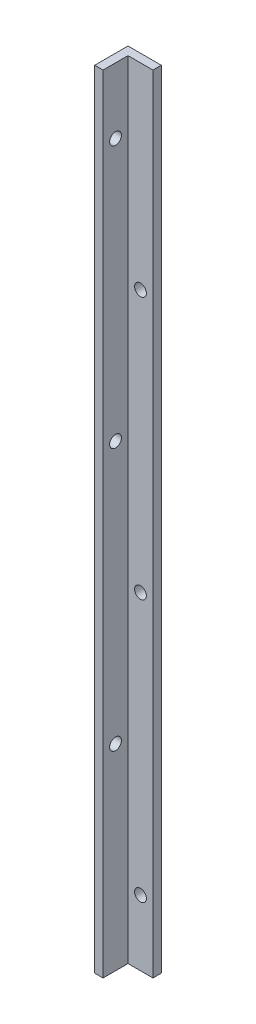
ISO-10303-21;
HEADER;
FILE_DESCRIPTION(('STEP AP214'),'2;1');
FILE_NAME('part.step','',(''),(''),'','','');
FILE_SCHEMA(('AUTOMOTIVE_DESIGN { 1 0 10303 214 1 1 1 1 }'));
ENDSEC;
DATA;
#1=APPLICATION_CONTEXT('core data for automotive mechanical design processes');
#2=APPLICATION_PROTOCOL_DEFINITION('international standard','automotive_design',2000,#1);
#3=PRODUCT_CONTEXT('',#1,'mechanical');
#4=PRODUCT('Part','Part','',(#3));
#5=PRODUCT_RELATED_PRODUCT_CATEGORY('part','',(#4));
#6=PRODUCT_DEFINITION_FORMATION('','',#4);
#7=PRODUCT_DEFINITION_CONTEXT('part definition',#1,'design');
#8=PRODUCT_DEFINITION('design','',#6,#7);
#9=PRODUCT_DEFINITION_SHAPE('','',#8);
#10=(LENGTH_UNIT() NAMED_UNIT(*) SI_UNIT(.MILLI.,.METRE.));
#11=(NAMED_UNIT(*) PLANE_ANGLE_UNIT() SI_UNIT($,.RADIAN.));
#12=(NAMED_UNIT(*) SI_UNIT($,.STERADIAN.) SOLID_ANGLE_UNIT());
#13=UNCERTAINTY_MEASURE_WITH_UNIT(LENGTH_MEASURE(1.E-05),#10,'distance_accuracy_value','');
#14=(GEOMETRIC_REPRESENTATION_CONTEXT(3) GLOBAL_UNCERTAINTY_ASSIGNED_CONTEXT((#13)) GLOBAL_UNIT_ASSIGNED_CONTEXT((#10,
#11,#12)) REPRESENTATION_CONTEXT('',''));
#15=CARTESIAN_POINT('',(0.,0.,0.));
#16=DIRECTION('',(0.,0.,1.));
#17=DIRECTION('',(1.,0.,0.));
#18=AXIS2_PLACEMENT_3D('',#15,#16,#17);
#19=CARTESIAN_POINT('',(0.,300.,0.));
#20=DIRECTION('',(0.,0.,1.));
#21=DIRECTION('',(1.,0.,0.));
#22=AXIS2_PLACEMENT_3D('',#19,#20,#21);
#23=PLANE('',#22);
#24=CARTESIAN_POINT('',(7.94000000000001,225.,0.));
#25=DIRECTION('',(0.,0.,1.));
#26=DIRECTION('',(1.,0.,0.));
#27=AXIS2_PLACEMENT_3D('',#24,#25,#26);
#28=CIRCLE('',#27,2.25);
#29=CARTESIAN_POINT('',(10.19,225.,0.));
#30=VERTEX_POINT('',#29);
#31=EDGE_CURVE('E169',#30,#30,#28,.T.);
#32=ORIENTED_EDGE('',*,*,#31,.T.);
#33=EDGE_LOOP('',(#32));
#34=FACE_BOUND('',#33,.T.);
#35=CARTESIAN_POINT('',(7.94000000000001,125.,0.));
#36=DIRECTION('',(0.,0.,1.));
#37=DIRECTION('',(1.,0.,0.));
#38=AXIS2_PLACEMENT_3D('',#35,#36,#37);
#39=CIRCLE('',#38,2.25);
#40=CARTESIAN_POINT('',(10.19,125.,0.));
#41=VERTEX_POINT('',#40);
#42=EDGE_CURVE('E173',#41,#41,#39,.T.);
#43=ORIENTED_EDGE('',*,*,#42,.T.);
#44=EDGE_LOOP('',(#43));
#45=FACE_BOUND('',#44,.T.);
#46=CARTESIAN_POINT('',(7.94000000000001,25.,0.));
#47=DIRECTION('',(0.,0.,1.));
#48=DIRECTION('',(1.,0.,0.));
#49=AXIS2_PLACEMENT_3D('',#46,#47,#48);
#50=CIRCLE('',#49,2.25);
#51=CARTESIAN_POINT('',(10.19,25.,0.));
#52=VERTEX_POINT('',#51);
#53=EDGE_CURVE('E176',#52,#52,#50,.T.);
#54=ORIENTED_EDGE('',*,*,#53,.T.);
#55=EDGE_LOOP('',(#54));
#56=FACE_BOUND('',#55,.T.);
#57=DIRECTION('',(-1.,0.,0.));
#58=VECTOR('',#57,1.);
#59=CARTESIAN_POINT('',(0.,0.,0.));
#60=LINE('',#59,#58);
#61=CARTESIAN_POINT('',(12.7,0.,0.));
#62=VERTEX_POINT('',#61);
#63=CARTESIAN_POINT('',(0.,0.,0.));
#64=VERTEX_POINT('',#63);
#65=EDGE_CURVE('E124',#62,#64,#60,.T.);
#66=ORIENTED_EDGE('',*,*,#65,.T.);
#67=DIRECTION('',(0.,-1.,0.));
#68=VECTOR('',#67,1.);
#69=CARTESIAN_POINT('',(0.,300.,0.));
#70=LINE('',#69,#68);
#71=CARTESIAN_POINT('',(0.,300.,0.));
#72=VERTEX_POINT('',#71);
#73=EDGE_CURVE('E11',#72,#64,#70,.T.);
#74=ORIENTED_EDGE('',*,*,#73,.F.);
#75=DIRECTION('',(-1.,0.,0.));
#76=VECTOR('',#75,1.);
#77=CARTESIAN_POINT('',(0.,300.,0.));
#78=LINE('',#77,#76);
#79=CARTESIAN_POINT('',(12.7,300.,0.));
#80=VERTEX_POINT('',#79);
#81=EDGE_CURVE('E135',#80,#72,#78,.T.);
#82=ORIENTED_EDGE('',*,*,#81,.F.);
#83=DIRECTION('',(0.,-1.,0.));
#84=VECTOR('',#83,1.);
#85=CARTESIAN_POINT('',(12.7,300.,0.));
#86=LINE('',#85,#84);
#87=EDGE_CURVE('E120',#80,#62,#86,.T.);
#88=ORIENTED_EDGE('',*,*,#87,.T.);
#89=EDGE_LOOP('',(#66,#74,#82,#88));
#90=FACE_BOUND('',#89,.T.);
#91=ADVANCED_FACE('F40',(#34,#45,#56,#90),#23,.F.);
#92=CARTESIAN_POINT('',(0.,300.,0.));
#93=DIRECTION('',(1.,0.,0.));
#94=DIRECTION('',(0.,0.,-1.));
#95=AXIS2_PLACEMENT_3D('',#92,#93,#94);
#96=PLANE('',#95);
#97=CARTESIAN_POINT('',(0.,275.,7.94));
#98=DIRECTION('',(1.,0.,0.));
#99=DIRECTION('',(0.,0.,-1.));
#100=AXIS2_PLACEMENT_3D('',#97,#98,#99);
#101=CIRCLE('',#100,2.25);
#102=CARTESIAN_POINT('',(0.,275.,5.68999999999999));
#103=VERTEX_POINT('',#102);
#104=EDGE_CURVE('E128',#103,#103,#101,.T.);
#105=ORIENTED_EDGE('',*,*,#104,.T.);
#106=EDGE_LOOP('',(#105));
#107=FACE_BOUND('',#106,.T.);
#108=CARTESIAN_POINT('',(0.,175.,7.94));
#109=DIRECTION('',(1.,0.,0.));
#110=DIRECTION('',(0.,0.,-1.));
#111=AXIS2_PLACEMENT_3D('',#108,#109,#110);
#112=CIRCLE('',#111,2.25);
#113=CARTESIAN_POINT('',(0.,175.,5.68999999999999));
#114=VERTEX_POINT('',#113);
#115=EDGE_CURVE('E201',#114,#114,#112,.T.);
#116=ORIENTED_EDGE('',*,*,#115,.T.);
#117=EDGE_LOOP('',(#116));
#118=FACE_BOUND('',#117,.T.);
#119=CARTESIAN_POINT('',(0.,75.,7.94));
#120=DIRECTION('',(1.,0.,0.));
#121=DIRECTION('',(0.,0.,-1.));
#122=AXIS2_PLACEMENT_3D('',#119,#120,#121);
#123=CIRCLE('',#122,2.25);
#124=CARTESIAN_POINT('',(0.,75.,5.68999999999999));
#125=VERTEX_POINT('',#124);
#126=EDGE_CURVE('E193',#125,#125,#123,.T.);
#127=ORIENTED_EDGE('',*,*,#126,.T.);
#128=EDGE_LOOP('',(#127));
#129=FACE_BOUND('',#128,.T.);
#130=DIRECTION('',(0.,0.,1.));
#131=VECTOR('',#130,1.);
#132=CARTESIAN_POINT('',(0.,0.,0.));
#133=LINE('',#132,#131);
#134=CARTESIAN_POINT('',(0.,0.,12.7));
#135=VERTEX_POINT('',#134);
#136=EDGE_CURVE('E127',#64,#135,#133,.T.);
#137=ORIENTED_EDGE('',*,*,#136,.T.);
#138=DIRECTION('',(0.,-1.,0.));
#139=VECTOR('',#138,1.);
#140=CARTESIAN_POINT('',(0.,300.,12.7));
#141=LINE('',#140,#139);
#142=CARTESIAN_POINT('',(0.,300.,12.7));
#143=VERTEX_POINT('',#142);
#144=EDGE_CURVE('E48',#143,#135,#141,.T.);
#145=ORIENTED_EDGE('',*,*,#144,.F.);
#146=DIRECTION('',(0.,0.,1.));
#147=VECTOR('',#146,1.);
#148=CARTESIAN_POINT('',(0.,300.,0.));
#149=LINE('',#148,#147);
#150=EDGE_CURVE('E93',#72,#143,#149,.T.);
#151=ORIENTED_EDGE('',*,*,#150,.F.);
#152=ORIENTED_EDGE('',*,*,#73,.T.);
#153=EDGE_LOOP('',(#137,#145,#151,#152));
#154=FACE_BOUND('',#153,.T.);
#155=ADVANCED_FACE('F160',(#107,#118,#129,#154),#96,.F.);
#156=CARTESIAN_POINT('',(0.,300.,12.7));
#157=DIRECTION('',(0.,0.,-1.));
#158=DIRECTION('',(-1.,0.,0.));
#159=AXIS2_PLACEMENT_3D('',#156,#157,#158);
#160=PLANE('',#159);
#161=DIRECTION('',(1.,0.,0.));
#162=VECTOR('',#161,1.);
#163=CARTESIAN_POINT('',(0.,0.,12.7));
#164=LINE('',#163,#162);
#165=CARTESIAN_POINT('',(3.18,0.,12.7));
#166=VERTEX_POINT('',#165);
#167=EDGE_CURVE('E130',#135,#166,#164,.T.);
#168=ORIENTED_EDGE('',*,*,#167,.T.);
#169=DIRECTION('',(0.,-1.,0.));
#170=VECTOR('',#169,1.);
#171=CARTESIAN_POINT('',(3.18,300.,12.7));
#172=LINE('',#171,#170);
#173=CARTESIAN_POINT('',(3.18,300.,12.7));
#174=VERTEX_POINT('',#173);
#175=EDGE_CURVE('E115',#174,#166,#172,.T.);
#176=ORIENTED_EDGE('',*,*,#175,.F.);
#177=DIRECTION('',(1.,0.,0.));
#178=VECTOR('',#177,1.);
#179=CARTESIAN_POINT('',(0.,300.,12.7));
#180=LINE('',#179,#178);
#181=EDGE_CURVE('E106',#143,#174,#180,.T.);
#182=ORIENTED_EDGE('',*,*,#181,.F.);
#183=ORIENTED_EDGE('',*,*,#144,.T.);
#184=EDGE_LOOP('',(#168,#176,#182,#183));
#185=FACE_BOUND('',#184,.T.);
#186=ADVANCED_FACE('F141',(#185),#160,.F.);
#187=CARTESIAN_POINT('',(3.18,300.,3.18));
#188=DIRECTION('',(-1.,0.,0.));
#189=DIRECTION('',(0.,0.,1.));
#190=AXIS2_PLACEMENT_3D('',#187,#188,#189);
#191=PLANE('',#190);
#192=CARTESIAN_POINT('',(3.18,275.,7.94));
#193=DIRECTION('',(1.,0.,0.));
#194=DIRECTION('',(0.,0.,-1.));
#195=AXIS2_PLACEMENT_3D('',#192,#193,#194);
#196=CIRCLE('',#195,2.25);
#197=CARTESIAN_POINT('',(3.18,275.,5.68999999999999));
#198=VERTEX_POINT('',#197);
#199=EDGE_CURVE('E190',#198,#198,#196,.T.);
#200=ORIENTED_EDGE('',*,*,#199,.F.);
#201=EDGE_LOOP('',(#200));
#202=FACE_BOUND('',#201,.T.);
#203=CARTESIAN_POINT('',(3.18,175.,7.94));
#204=DIRECTION('',(1.,0.,0.));
#205=DIRECTION('',(0.,0.,-1.));
#206=AXIS2_PLACEMENT_3D('',#203,#204,#205);
#207=CIRCLE('',#206,2.25);
#208=CARTESIAN_POINT('',(3.18,175.,5.68999999999999));
#209=VERTEX_POINT('',#208);
#210=EDGE_CURVE('E194',#209,#209,#207,.T.);
#211=ORIENTED_EDGE('',*,*,#210,.F.);
#212=EDGE_LOOP('',(#211));
#213=FACE_BOUND('',#212,.T.);
#214=CARTESIAN_POINT('',(3.18,75.,7.94));
#215=DIRECTION('',(1.,0.,0.));
#216=DIRECTION('',(0.,0.,-1.));
#217=AXIS2_PLACEMENT_3D('',#214,#215,#216);
#218=CIRCLE('',#217,2.25);
#219=CARTESIAN_POINT('',(3.18,75.,5.68999999999999));
#220=VERTEX_POINT('',#219);
#221=EDGE_CURVE('E189',#220,#220,#218,.T.);
#222=ORIENTED_EDGE('',*,*,#221,.F.);
#223=EDGE_LOOP('',(#222));
#224=FACE_BOUND('',#223,.T.);
#225=DIRECTION('',(0.,0.,-1.));
#226=VECTOR('',#225,1.);
#227=CARTESIAN_POINT('',(3.18,0.,3.18));
#228=LINE('',#227,#226);
#229=CARTESIAN_POINT('',(3.18,0.,3.18));
#230=VERTEX_POINT('',#229);
#231=EDGE_CURVE('E114',#166,#230,#228,.T.);
#232=ORIENTED_EDGE('',*,*,#231,.T.);
#233=DIRECTION('',(0.,-1.,0.));
#234=VECTOR('',#233,1.);
#235=CARTESIAN_POINT('',(3.18,300.,3.18));
#236=LINE('',#235,#234);
#237=CARTESIAN_POINT('',(3.18,300.,3.18));
#238=VERTEX_POINT('',#237);
#239=EDGE_CURVE('E111',#238,#230,#236,.T.);
#240=ORIENTED_EDGE('',*,*,#239,.F.);
#241=DIRECTION('',(0.,0.,-1.));
#242=VECTOR('',#241,1.);
#243=CARTESIAN_POINT('',(3.18,300.,3.18));
#244=LINE('',#243,#242);
#245=EDGE_CURVE('E100',#174,#238,#244,.T.);
#246=ORIENTED_EDGE('',*,*,#245,.F.);
#247=ORIENTED_EDGE('',*,*,#175,.T.);
#248=EDGE_LOOP('',(#232,#240,#246,#247));
#249=FACE_BOUND('',#248,.T.);
#250=ADVANCED_FACE('F112',(#202,#213,#224,#249),#191,.F.);
#251=CARTESIAN_POINT('',(3.18,300.,3.18));
#252=DIRECTION('',(0.,0.,-1.));
#253=DIRECTION('',(-1.,0.,0.));
#254=AXIS2_PLACEMENT_3D('',#251,#252,#253);
#255=PLANE('',#254);
#256=CARTESIAN_POINT('',(7.94000000000001,225.,3.18));
#257=DIRECTION('',(0.,0.,1.));
#258=DIRECTION('',(1.,0.,0.));
#259=AXIS2_PLACEMENT_3D('',#256,#257,#258);
#260=CIRCLE('',#259,2.25);
#261=CARTESIAN_POINT('',(10.19,225.,3.18));
#262=VERTEX_POINT('',#261);
#263=EDGE_CURVE('E178',#262,#262,#260,.T.);
#264=ORIENTED_EDGE('',*,*,#263,.F.);
#265=EDGE_LOOP('',(#264));
#266=FACE_BOUND('',#265,.T.);
#267=CARTESIAN_POINT('',(7.94000000000001,125.,3.18));
#268=DIRECTION('',(0.,0.,1.));
#269=DIRECTION('',(1.,0.,0.));
#270=AXIS2_PLACEMENT_3D('',#267,#268,#269);
#271=CIRCLE('',#270,2.25);
#272=CARTESIAN_POINT('',(10.19,125.,3.18));
#273=VERTEX_POINT('',#272);
#274=EDGE_CURVE('E182',#273,#273,#271,.T.);
#275=ORIENTED_EDGE('',*,*,#274,.F.);
#276=EDGE_LOOP('',(#275));
#277=FACE_BOUND('',#276,.T.);
#278=CARTESIAN_POINT('',(7.94000000000001,25.,3.18));
#279=DIRECTION('',(0.,0.,1.));
#280=DIRECTION('',(1.,0.,0.));
#281=AXIS2_PLACEMENT_3D('',#278,#279,#280);
#282=CIRCLE('',#281,2.25);
#283=CARTESIAN_POINT('',(10.19,25.,3.18));
#284=VERTEX_POINT('',#283);
#285=EDGE_CURVE('E185',#284,#284,#282,.T.);
#286=ORIENTED_EDGE('',*,*,#285,.F.);
#287=EDGE_LOOP('',(#286));
#288=FACE_BOUND('',#287,.T.);
#289=DIRECTION('',(1.,0.,0.));
#290=VECTOR('',#289,1.);
#291=CARTESIAN_POINT('',(3.18,0.,3.18));
#292=LINE('',#291,#290);
#293=CARTESIAN_POINT('',(12.7,0.,3.18));
#294=VERTEX_POINT('',#293);
#295=EDGE_CURVE('E79',#230,#294,#292,.T.);
#296=ORIENTED_EDGE('',*,*,#295,.T.);
#297=DIRECTION('',(0.,-1.,0.));
#298=VECTOR('',#297,1.);
#299=CARTESIAN_POINT('',(12.7,300.,3.18));
#300=LINE('',#299,#298);
#301=CARTESIAN_POINT('',(12.7,300.,3.18));
#302=VERTEX_POINT('',#301);
#303=EDGE_CURVE('E116',#302,#294,#300,.T.);
#304=ORIENTED_EDGE('',*,*,#303,.F.);
#305=DIRECTION('',(1.,0.,0.));
#306=VECTOR('',#305,1.);
#307=CARTESIAN_POINT('',(3.18,300.,3.18));
#308=LINE('',#307,#306);
#309=EDGE_CURVE('E104',#238,#302,#308,.T.);
#310=ORIENTED_EDGE('',*,*,#309,.F.);
#311=ORIENTED_EDGE('',*,*,#239,.T.);
#312=EDGE_LOOP('',(#296,#304,#310,#311));
#313=FACE_BOUND('',#312,.T.);
#314=ADVANCED_FACE('F118',(#266,#277,#288,#313),#255,.F.);
#315=CARTESIAN_POINT('',(12.7,300.,3.18));
#316=DIRECTION('',(-1.,0.,0.));
#317=DIRECTION('',(0.,0.,1.));
#318=AXIS2_PLACEMENT_3D('',#315,#316,#317);
#319=PLANE('',#318);
#320=DIRECTION('',(0.,0.,-1.));
#321=VECTOR('',#320,1.);
#322=CARTESIAN_POINT('',(12.7,0.,3.18));
#323=LINE('',#322,#321);
#324=EDGE_CURVE('E85',#294,#62,#323,.T.);
#325=ORIENTED_EDGE('',*,*,#324,.T.);
#326=ORIENTED_EDGE('',*,*,#87,.F.);
#327=DIRECTION('',(0.,0.,-1.));
#328=VECTOR('',#327,1.);
#329=CARTESIAN_POINT('',(12.7,300.,3.18));
#330=LINE('',#329,#328);
#331=EDGE_CURVE('E56',#302,#80,#330,.T.);
#332=ORIENTED_EDGE('',*,*,#331,.F.);
#333=ORIENTED_EDGE('',*,*,#303,.T.);
#334=EDGE_LOOP('',(#325,#326,#332,#333));
#335=FACE_BOUND('',#334,.T.);
#336=ADVANCED_FACE('F148',(#335),#319,.F.);
#337=CARTESIAN_POINT('',(0.,300.,0.));
#338=DIRECTION('',(0.,1.,0.));
#339=DIRECTION('',(0.,0.,1.));
#340=AXIS2_PLACEMENT_3D('',#337,#338,#339);
#341=PLANE('',#340);
#342=ORIENTED_EDGE('',*,*,#81,.T.);
#343=ORIENTED_EDGE('',*,*,#150,.T.);
#344=ORIENTED_EDGE('',*,*,#181,.T.);
#345=ORIENTED_EDGE('',*,*,#245,.T.);
#346=ORIENTED_EDGE('',*,*,#309,.T.);
#347=ORIENTED_EDGE('',*,*,#331,.T.);
#348=EDGE_LOOP('',(#342,#343,#344,#345,#346,#347));
#349=FACE_BOUND('',#348,.T.);
#350=ADVANCED_FACE('F102',(#349),#341,.T.);
#351=CARTESIAN_POINT('',(0.,0.,0.));
#352=DIRECTION('',(0.,1.,0.));
#353=DIRECTION('',(0.,0.,1.));
#354=AXIS2_PLACEMENT_3D('',#351,#352,#353);
#355=PLANE('',#354);
#356=ORIENTED_EDGE('',*,*,#65,.F.);
#357=ORIENTED_EDGE('',*,*,#324,.F.);
#358=ORIENTED_EDGE('',*,*,#295,.F.);
#359=ORIENTED_EDGE('',*,*,#231,.F.);
#360=ORIENTED_EDGE('',*,*,#167,.F.);
#361=ORIENTED_EDGE('',*,*,#136,.F.);
#362=EDGE_LOOP('',(#356,#357,#358,#359,#360,#361));
#363=FACE_BOUND('',#362,.T.);
#364=ADVANCED_FACE('F144',(#363),#355,.F.);
#365=CARTESIAN_POINT('',(-6.82,75.,7.94));
#366=DIRECTION('',(1.,0.,0.));
#367=DIRECTION('',(0.,0.,-1.));
#368=AXIS2_PLACEMENT_3D('',#365,#366,#367);
#369=CYLINDRICAL_SURFACE('',#368,2.25);
#370=ORIENTED_EDGE('',*,*,#221,.T.);
#371=EDGE_LOOP('',(#370));
#372=FACE_BOUND('',#371,.T.);
#373=ORIENTED_EDGE('',*,*,#126,.F.);
#374=EDGE_LOOP('',(#373));
#375=FACE_BOUND('',#374,.T.);
#376=ADVANCED_FACE('F223',(#372,#375),#369,.F.);
#377=CARTESIAN_POINT('',(-6.82,175.,7.94));
#378=DIRECTION('',(1.,0.,0.));
#379=DIRECTION('',(0.,0.,-1.));
#380=AXIS2_PLACEMENT_3D('',#377,#378,#379);
#381=CYLINDRICAL_SURFACE('',#380,2.25);
#382=ORIENTED_EDGE('',*,*,#210,.T.);
#383=EDGE_LOOP('',(#382));
#384=FACE_BOUND('',#383,.T.);
#385=ORIENTED_EDGE('',*,*,#115,.F.);
#386=EDGE_LOOP('',(#385));
#387=FACE_BOUND('',#386,.T.);
#388=ADVANCED_FACE('F213',(#384,#387),#381,.F.);
#389=CARTESIAN_POINT('',(-6.82,275.,7.94));
#390=DIRECTION('',(1.,0.,0.));
#391=DIRECTION('',(0.,0.,-1.));
#392=AXIS2_PLACEMENT_3D('',#389,#390,#391);
#393=CYLINDRICAL_SURFACE('',#392,2.25);
#394=ORIENTED_EDGE('',*,*,#199,.T.);
#395=EDGE_LOOP('',(#394));
#396=FACE_BOUND('',#395,.T.);
#397=ORIENTED_EDGE('',*,*,#104,.F.);
#398=EDGE_LOOP('',(#397));
#399=FACE_BOUND('',#398,.T.);
#400=ADVANCED_FACE('F210',(#396,#399),#393,.F.);
#401=CARTESIAN_POINT('',(7.94000000000001,25.,-6.82));
#402=DIRECTION('',(0.,0.,1.));
#403=DIRECTION('',(1.,0.,0.));
#404=AXIS2_PLACEMENT_3D('',#401,#402,#403);
#405=CYLINDRICAL_SURFACE('',#404,2.25);
#406=ORIENTED_EDGE('',*,*,#285,.T.);
#407=EDGE_LOOP('',(#406));
#408=FACE_BOUND('',#407,.T.);
#409=ORIENTED_EDGE('',*,*,#53,.F.);
#410=EDGE_LOOP('',(#409));
#411=FACE_BOUND('',#410,.T.);
#412=ADVANCED_FACE('F212',(#408,#411),#405,.F.);
#413=CARTESIAN_POINT('',(7.94000000000001,125.,-6.82));
#414=DIRECTION('',(0.,0.,1.));
#415=DIRECTION('',(1.,0.,0.));
#416=AXIS2_PLACEMENT_3D('',#413,#414,#415);
#417=CYLINDRICAL_SURFACE('',#416,2.25);
#418=ORIENTED_EDGE('',*,*,#274,.T.);
#419=EDGE_LOOP('',(#418));
#420=FACE_BOUND('',#419,.T.);
#421=ORIENTED_EDGE('',*,*,#42,.F.);
#422=EDGE_LOOP('',(#421));
#423=FACE_BOUND('',#422,.T.);
#424=ADVANCED_FACE('F220',(#420,#423),#417,.F.);
#425=CARTESIAN_POINT('',(7.94000000000001,225.,-6.82));
#426=DIRECTION('',(0.,0.,1.));
#427=DIRECTION('',(1.,0.,0.));
#428=AXIS2_PLACEMENT_3D('',#425,#426,#427);
#429=CYLINDRICAL_SURFACE('',#428,2.25);
#430=ORIENTED_EDGE('',*,*,#263,.T.);
#431=EDGE_LOOP('',(#430));
#432=FACE_BOUND('',#431,.T.);
#433=ORIENTED_EDGE('',*,*,#31,.F.);
#434=EDGE_LOOP('',(#433));
#435=FACE_BOUND('',#434,.T.);
#436=ADVANCED_FACE('F283',(#432,#435),#429,.F.);
#437=CLOSED_SHELL('',(#91,#155,#186,#250,#314,#336,#350,#364,#376,#388,#400,#412,#424,#436));
#438=MANIFOLD_SOLID_BREP('B2',#437);
#439=ADVANCED_BREP_SHAPE_REPRESENTATION('',(#18,#438),#14);
#440=SHAPE_DEFINITION_REPRESENTATION(#9,#439);
ENDSEC;
END-ISO-10303-21;
